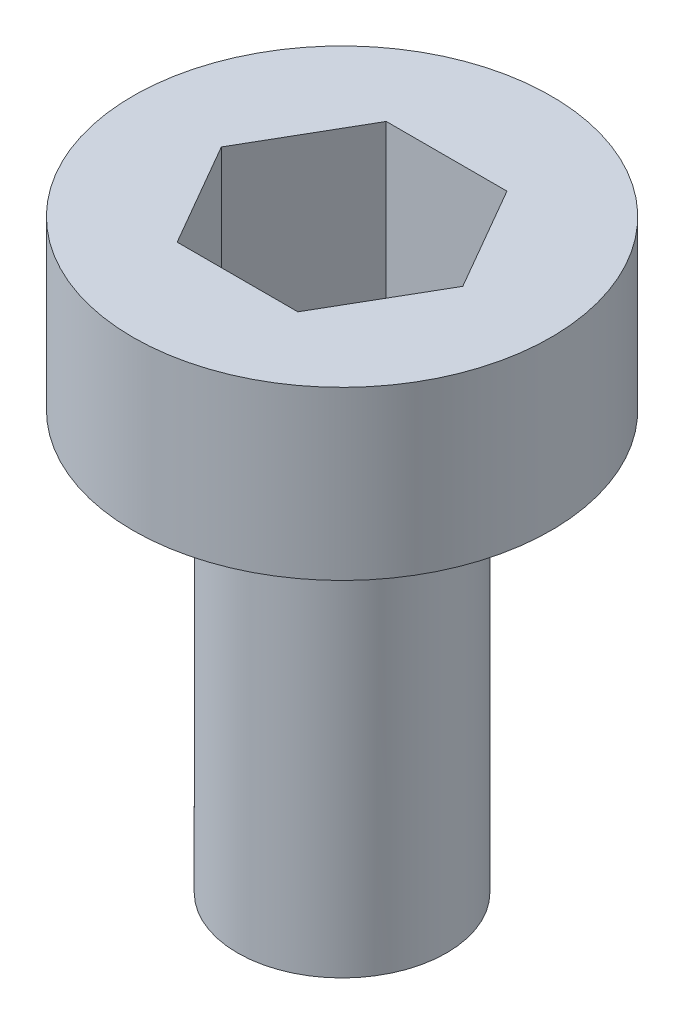
ISO-10303-21;
HEADER;
FILE_DESCRIPTION(('STEP AP214'),'2;1');
FILE_NAME('part.step','',(''),(''),'','','');
FILE_SCHEMA(('AUTOMOTIVE_DESIGN { 1 0 10303 214 1 1 1 1 }'));
ENDSEC;
DATA;
#1=APPLICATION_CONTEXT('core data for automotive mechanical design processes');
#2=APPLICATION_PROTOCOL_DEFINITION('international standard','automotive_design',2000,#1);
#3=PRODUCT_CONTEXT('',#1,'mechanical');
#4=PRODUCT('Part','Part','',(#3));
#5=PRODUCT_RELATED_PRODUCT_CATEGORY('part','',(#4));
#6=PRODUCT_DEFINITION_FORMATION('','',#4);
#7=PRODUCT_DEFINITION_CONTEXT('part definition',#1,'design');
#8=PRODUCT_DEFINITION('design','',#6,#7);
#9=PRODUCT_DEFINITION_SHAPE('','',#8);
#10=(LENGTH_UNIT() NAMED_UNIT(*) SI_UNIT(.MILLI.,.METRE.));
#11=(NAMED_UNIT(*) PLANE_ANGLE_UNIT() SI_UNIT($,.RADIAN.));
#12=(NAMED_UNIT(*) SI_UNIT($,.STERADIAN.) SOLID_ANGLE_UNIT());
#13=UNCERTAINTY_MEASURE_WITH_UNIT(LENGTH_MEASURE(1.E-05),#10,'distance_accuracy_value','');
#14=(GEOMETRIC_REPRESENTATION_CONTEXT(3) GLOBAL_UNCERTAINTY_ASSIGNED_CONTEXT((#13)) GLOBAL_UNIT_ASSIGNED_CONTEXT((#10,
#11,#12)) REPRESENTATION_CONTEXT('',''));
#15=CARTESIAN_POINT('',(0.,0.,0.));
#16=DIRECTION('',(0.,0.,1.));
#17=DIRECTION('',(1.,0.,0.));
#18=AXIS2_PLACEMENT_3D('',#15,#16,#17);
#19=CARTESIAN_POINT('',(0.,4.,0.));
#20=DIRECTION('',(0.,1.,0.));
#21=DIRECTION('',(0.,0.,1.));
#22=AXIS2_PLACEMENT_3D('',#19,#20,#21);
#23=PLANE('',#22);
#24=CARTESIAN_POINT('',(0.,4.,0.));
#25=DIRECTION('',(0.,1.,0.));
#26=DIRECTION('',(0.,0.,1.));
#27=AXIS2_PLACEMENT_3D('',#24,#25,#26);
#28=CIRCLE('',#27,5.);
#29=CARTESIAN_POINT('',(0.,4.,5.));
#30=VERTEX_POINT('',#29);
#31=EDGE_CURVE('E12',#30,#30,#28,.T.);
#32=ORIENTED_EDGE('',*,*,#31,.T.);
#33=EDGE_LOOP('',(#32));
#34=FACE_BOUND('',#33,.T.);
#35=DIRECTION('',(-0.499999999999998,0.,-0.86602540378444));
#36=VECTOR('',#35,1.);
#37=CARTESIAN_POINT('',(2.88675134594813,4.,0.));
#38=LINE('',#37,#36);
#39=CARTESIAN_POINT('',(2.88675134594813,4.,0.));
#40=VERTEX_POINT('',#39);
#41=CARTESIAN_POINT('',(1.44337567297408,4.,-2.49999999999999));
#42=VERTEX_POINT('',#41);
#43=EDGE_CURVE('E102',#40,#42,#38,.T.);
#44=ORIENTED_EDGE('',*,*,#43,.F.);
#45=DIRECTION('',(0.500000000000002,0.,-0.866025403784438));
#46=VECTOR('',#45,1.);
#47=CARTESIAN_POINT('',(1.44337567297407,4.,2.49999999999999));
#48=LINE('',#47,#46);
#49=CARTESIAN_POINT('',(1.44337567297407,4.,2.49999999999999));
#50=VERTEX_POINT('',#49);
#51=EDGE_CURVE('E94',#50,#40,#48,.T.);
#52=ORIENTED_EDGE('',*,*,#51,.F.);
#53=DIRECTION('',(1.,0.,0.));
#54=VECTOR('',#53,1.);
#55=CARTESIAN_POINT('',(-1.44337567297405,4.,2.49999999999998));
#56=LINE('',#55,#54);
#57=CARTESIAN_POINT('',(-1.44337567297405,4.,2.49999999999998));
#58=VERTEX_POINT('',#57);
#59=EDGE_CURVE('E122',#58,#50,#56,.T.);
#60=ORIENTED_EDGE('',*,*,#59,.F.);
#61=DIRECTION('',(0.499999999999998,0.,0.86602540378444));
#62=VECTOR('',#61,1.);
#63=CARTESIAN_POINT('',(-2.88675134594811,4.,0.));
#64=LINE('',#63,#62);
#65=CARTESIAN_POINT('',(-2.88675134594811,4.,0.));
#66=VERTEX_POINT('',#65);
#67=EDGE_CURVE('E120',#66,#58,#64,.T.);
#68=ORIENTED_EDGE('',*,*,#67,.F.);
#69=DIRECTION('',(-0.500000000000002,0.,0.866025403784437));
#70=VECTOR('',#69,1.);
#71=CARTESIAN_POINT('',(-1.44337567297404,4.,-2.5));
#72=LINE('',#71,#70);
#73=CARTESIAN_POINT('',(-1.44337567297404,4.,-2.5));
#74=VERTEX_POINT('',#73);
#75=EDGE_CURVE('E116',#74,#66,#72,.T.);
#76=ORIENTED_EDGE('',*,*,#75,.F.);
#77=DIRECTION('',(-1.,0.,0.));
#78=VECTOR('',#77,1.);
#79=CARTESIAN_POINT('',(1.44337567297408,4.,-2.49999999999999));
#80=LINE('',#79,#78);
#81=EDGE_CURVE('E114',#42,#74,#80,.T.);
#82=ORIENTED_EDGE('',*,*,#81,.F.);
#83=EDGE_LOOP('',(#44,#52,#60,#68,#76,#82));
#84=FACE_BOUND('',#83,.T.);
#85=ADVANCED_FACE('F41',(#34,#84),#23,.T.);
#86=CARTESIAN_POINT('',(0.,0.,0.));
#87=DIRECTION('',(0.,1.,0.));
#88=DIRECTION('',(0.,0.,1.));
#89=AXIS2_PLACEMENT_3D('',#86,#87,#88);
#90=PLANE('',#89);
#91=CARTESIAN_POINT('',(0.,0.,0.));
#92=DIRECTION('',(0.,1.,0.));
#93=DIRECTION('',(0.,0.,1.));
#94=AXIS2_PLACEMENT_3D('',#91,#92,#93);
#95=CIRCLE('',#94,5.);
#96=CARTESIAN_POINT('',(0.,0.,5.));
#97=VERTEX_POINT('',#96);
#98=EDGE_CURVE('E45',#97,#97,#95,.T.);
#99=ORIENTED_EDGE('',*,*,#98,.F.);
#100=EDGE_LOOP('',(#99));
#101=FACE_BOUND('',#100,.T.);
#102=DIRECTION('',(0.500000000000002,0.,-0.866025403784438));
#103=VECTOR('',#102,1.);
#104=CARTESIAN_POINT('',(1.44337567297407,0.,2.49999999999999));
#105=LINE('',#104,#103);
#106=CARTESIAN_POINT('',(1.44337567297407,0.,2.49999999999999));
#107=VERTEX_POINT('',#106);
#108=CARTESIAN_POINT('',(2.88675134594813,0.,0.));
#109=VERTEX_POINT('',#108);
#110=EDGE_CURVE('E64',#107,#109,#105,.T.);
#111=ORIENTED_EDGE('',*,*,#110,.T.);
#112=DIRECTION('',(-0.499999999999998,0.,-0.86602540378444));
#113=VECTOR('',#112,1.);
#114=CARTESIAN_POINT('',(2.88675134594813,0.,0.));
#115=LINE('',#114,#113);
#116=CARTESIAN_POINT('',(1.44337567297408,0.,-2.49999999999999));
#117=VERTEX_POINT('',#116);
#118=EDGE_CURVE('E109',#109,#117,#115,.T.);
#119=ORIENTED_EDGE('',*,*,#118,.T.);
#120=DIRECTION('',(-1.,0.,0.));
#121=VECTOR('',#120,1.);
#122=CARTESIAN_POINT('',(1.44337567297408,0.,-2.49999999999999));
#123=LINE('',#122,#121);
#124=CARTESIAN_POINT('',(-1.44337567297404,0.,-2.5));
#125=VERTEX_POINT('',#124);
#126=EDGE_CURVE('E126',#117,#125,#123,.T.);
#127=ORIENTED_EDGE('',*,*,#126,.T.);
#128=DIRECTION('',(-0.500000000000002,0.,0.866025403784437));
#129=VECTOR('',#128,1.);
#130=CARTESIAN_POINT('',(-1.44337567297404,0.,-2.5));
#131=LINE('',#130,#129);
#132=CARTESIAN_POINT('',(-2.88675134594811,0.,0.));
#133=VERTEX_POINT('',#132);
#134=EDGE_CURVE('E129',#125,#133,#131,.T.);
#135=ORIENTED_EDGE('',*,*,#134,.T.);
#136=DIRECTION('',(0.499999999999998,0.,0.86602540378444));
#137=VECTOR('',#136,1.);
#138=CARTESIAN_POINT('',(-2.88675134594811,0.,0.));
#139=LINE('',#138,#137);
#140=CARTESIAN_POINT('',(-1.44337567297405,0.,2.49999999999998));
#141=VERTEX_POINT('',#140);
#142=EDGE_CURVE('E132',#133,#141,#139,.T.);
#143=ORIENTED_EDGE('',*,*,#142,.T.);
#144=DIRECTION('',(1.,0.,0.));
#145=VECTOR('',#144,1.);
#146=CARTESIAN_POINT('',(-1.44337567297405,0.,2.49999999999998));
#147=LINE('',#146,#145);
#148=EDGE_CURVE('E103',#141,#107,#147,.T.);
#149=ORIENTED_EDGE('',*,*,#148,.T.);
#150=EDGE_LOOP('',(#111,#119,#127,#135,#143,#149));
#151=FACE_BOUND('',#150,.T.);
#152=ADVANCED_FACE('F149',(#101,#151),#90,.F.);
#153=CARTESIAN_POINT('',(0.,4.,0.));
#154=DIRECTION('',(0.,-1.,0.));
#155=DIRECTION('',(0.,0.,-1.));
#156=AXIS2_PLACEMENT_3D('',#153,#154,#155);
#157=CYLINDRICAL_SURFACE('',#156,5.);
#158=ORIENTED_EDGE('',*,*,#31,.F.);
#159=EDGE_LOOP('',(#158));
#160=FACE_BOUND('',#159,.T.);
#161=ORIENTED_EDGE('',*,*,#98,.T.);
#162=EDGE_LOOP('',(#161));
#163=FACE_BOUND('',#162,.T.);
#164=ADVANCED_FACE('F43',(#160,#163),#157,.T.);
#165=CARTESIAN_POINT('',(1.44337567297407,4.,2.49999999999999));
#166=DIRECTION('',(-0.866025403784438,0.,-0.500000000000002));
#167=DIRECTION('',(-0.500000000000002,0.,0.866025403784438));
#168=AXIS2_PLACEMENT_3D('',#165,#166,#167);
#169=PLANE('',#168);
#170=ORIENTED_EDGE('',*,*,#110,.F.);
#171=DIRECTION('',(0.,-1.,0.));
#172=VECTOR('',#171,1.);
#173=CARTESIAN_POINT('',(1.44337567297407,4.,2.49999999999999));
#174=LINE('',#173,#172);
#175=EDGE_CURVE('E98',#50,#107,#174,.T.);
#176=ORIENTED_EDGE('',*,*,#175,.F.);
#177=ORIENTED_EDGE('',*,*,#51,.T.);
#178=DIRECTION('',(0.,-1.,0.));
#179=VECTOR('',#178,1.);
#180=CARTESIAN_POINT('',(2.88675134594813,4.,0.));
#181=LINE('',#180,#179);
#182=EDGE_CURVE('E97',#40,#109,#181,.T.);
#183=ORIENTED_EDGE('',*,*,#182,.T.);
#184=EDGE_LOOP('',(#170,#176,#177,#183));
#185=FACE_BOUND('',#184,.T.);
#186=ADVANCED_FACE('F96',(#185),#169,.T.);
#187=CARTESIAN_POINT('',(2.88675134594813,4.,0.));
#188=DIRECTION('',(-0.86602540378444,0.,0.499999999999998));
#189=DIRECTION('',(0.499999999999998,0.,0.86602540378444));
#190=AXIS2_PLACEMENT_3D('',#187,#188,#189);
#191=PLANE('',#190);
#192=ORIENTED_EDGE('',*,*,#118,.F.);
#193=ORIENTED_EDGE('',*,*,#182,.F.);
#194=ORIENTED_EDGE('',*,*,#43,.T.);
#195=DIRECTION('',(0.,-1.,0.));
#196=VECTOR('',#195,1.);
#197=CARTESIAN_POINT('',(1.44337567297408,4.,-2.49999999999999));
#198=LINE('',#197,#196);
#199=EDGE_CURVE('E110',#42,#117,#198,.T.);
#200=ORIENTED_EDGE('',*,*,#199,.T.);
#201=EDGE_LOOP('',(#192,#193,#194,#200));
#202=FACE_BOUND('',#201,.T.);
#203=ADVANCED_FACE('F106',(#202),#191,.T.);
#204=CARTESIAN_POINT('',(1.44337567297408,4.,-2.49999999999999));
#205=DIRECTION('',(0.,0.,1.));
#206=DIRECTION('',(1.,0.,0.));
#207=AXIS2_PLACEMENT_3D('',#204,#205,#206);
#208=PLANE('',#207);
#209=ORIENTED_EDGE('',*,*,#126,.F.);
#210=ORIENTED_EDGE('',*,*,#199,.F.);
#211=ORIENTED_EDGE('',*,*,#81,.T.);
#212=DIRECTION('',(0.,-1.,0.));
#213=VECTOR('',#212,1.);
#214=CARTESIAN_POINT('',(-1.44337567297404,4.,-2.5));
#215=LINE('',#214,#213);
#216=EDGE_CURVE('E141',#74,#125,#215,.T.);
#217=ORIENTED_EDGE('',*,*,#216,.T.);
#218=EDGE_LOOP('',(#209,#210,#211,#217));
#219=FACE_BOUND('',#218,.T.);
#220=ADVANCED_FACE('F145',(#219),#208,.T.);
#221=CARTESIAN_POINT('',(-1.44337567297404,4.,-2.5));
#222=DIRECTION('',(0.866025403784437,0.,0.500000000000002));
#223=DIRECTION('',(0.500000000000002,0.,-0.866025403784437));
#224=AXIS2_PLACEMENT_3D('',#221,#222,#223);
#225=PLANE('',#224);
#226=ORIENTED_EDGE('',*,*,#134,.F.);
#227=ORIENTED_EDGE('',*,*,#216,.F.);
#228=ORIENTED_EDGE('',*,*,#75,.T.);
#229=DIRECTION('',(0.,-1.,0.));
#230=VECTOR('',#229,1.);
#231=CARTESIAN_POINT('',(-2.88675134594811,4.,0.));
#232=LINE('',#231,#230);
#233=EDGE_CURVE('E139',#66,#133,#232,.T.);
#234=ORIENTED_EDGE('',*,*,#233,.T.);
#235=EDGE_LOOP('',(#226,#227,#228,#234));
#236=FACE_BOUND('',#235,.T.);
#237=ADVANCED_FACE('F157',(#236),#225,.T.);
#238=CARTESIAN_POINT('',(-2.88675134594811,4.,0.));
#239=DIRECTION('',(0.86602540378444,0.,-0.499999999999998));
#240=DIRECTION('',(-0.499999999999998,0.,-0.86602540378444));
#241=AXIS2_PLACEMENT_3D('',#238,#239,#240);
#242=PLANE('',#241);
#243=ORIENTED_EDGE('',*,*,#142,.F.);
#244=ORIENTED_EDGE('',*,*,#233,.F.);
#245=ORIENTED_EDGE('',*,*,#67,.T.);
#246=DIRECTION('',(0.,-1.,0.));
#247=VECTOR('',#246,1.);
#248=CARTESIAN_POINT('',(-1.44337567297405,4.,2.49999999999998));
#249=LINE('',#248,#247);
#250=EDGE_CURVE('E56',#58,#141,#249,.T.);
#251=ORIENTED_EDGE('',*,*,#250,.T.);
#252=EDGE_LOOP('',(#243,#244,#245,#251));
#253=FACE_BOUND('',#252,.T.);
#254=ADVANCED_FACE('F155',(#253),#242,.T.);
#255=CARTESIAN_POINT('',(-1.44337567297405,4.,2.49999999999998));
#256=DIRECTION('',(0.,0.,-1.));
#257=DIRECTION('',(-1.,0.,0.));
#258=AXIS2_PLACEMENT_3D('',#255,#256,#257);
#259=PLANE('',#258);
#260=ORIENTED_EDGE('',*,*,#148,.F.);
#261=ORIENTED_EDGE('',*,*,#250,.F.);
#262=ORIENTED_EDGE('',*,*,#59,.T.);
#263=ORIENTED_EDGE('',*,*,#175,.T.);
#264=EDGE_LOOP('',(#260,#261,#262,#263));
#265=FACE_BOUND('',#264,.T.);
#266=ADVANCED_FACE('F151',(#265),#259,.T.);
#267=CLOSED_SHELL('',(#85,#152,#164,#186,#203,#220,#237,#254,#266));
#268=MANIFOLD_SOLID_BREP('B2',#267);
#269=CARTESIAN_POINT('',(0.,-10.,0.));
#270=DIRECTION('',(0.,1.,0.));
#271=DIRECTION('',(0.,0.,1.));
#272=AXIS2_PLACEMENT_3D('',#269,#270,#271);
#273=CYLINDRICAL_SURFACE('',#272,2.5);
#274=CARTESIAN_POINT('',(0.,-10.,0.));
#275=DIRECTION('',(0.,1.,0.));
#276=DIRECTION('',(0.,0.,1.));
#277=AXIS2_PLACEMENT_3D('',#274,#275,#276);
#278=CIRCLE('',#277,2.5);
#279=CARTESIAN_POINT('',(0.,-10.,2.5));
#280=VERTEX_POINT('',#279);
#281=EDGE_CURVE('E39',#280,#280,#278,.T.);
#282=ORIENTED_EDGE('',*,*,#281,.T.);
#283=EDGE_LOOP('',(#282));
#284=FACE_BOUND('',#283,.T.);
#285=CARTESIAN_POINT('',(0.,0.,0.));
#286=DIRECTION('',(0.,1.,0.));
#287=DIRECTION('',(0.,0.,1.));
#288=AXIS2_PLACEMENT_3D('',#285,#286,#287);
#289=CIRCLE('',#288,2.5);
#290=CARTESIAN_POINT('',(0.,0.,2.49999999999999));
#291=VERTEX_POINT('',#290);
#292=CARTESIAN_POINT('',(2.16506350946109,0.,1.25));
#293=VERTEX_POINT('',#292);
#294=EDGE_CURVE('E241',#291,#293,#289,.T.);
#295=ORIENTED_EDGE('',*,*,#294,.F.);
#296=CARTESIAN_POINT('',(-2.16506350946108,0.,1.24999999999999));
#297=VERTEX_POINT('',#296);
#298=EDGE_CURVE('E252',#297,#291,#289,.T.);
#299=ORIENTED_EDGE('',*,*,#298,.F.);
#300=CARTESIAN_POINT('',(-2.16506350946108,0.,-1.25));
#301=VERTEX_POINT('',#300);
#302=EDGE_CURVE('E256',#301,#297,#289,.T.);
#303=ORIENTED_EDGE('',*,*,#302,.F.);
#304=CARTESIAN_POINT('',(0.,0.,-2.5));
#305=VERTEX_POINT('',#304);
#306=EDGE_CURVE('E274',#305,#301,#289,.T.);
#307=ORIENTED_EDGE('',*,*,#306,.F.);
#308=CARTESIAN_POINT('',(2.1650635094611,0.,-1.25));
#309=VERTEX_POINT('',#308);
#310=EDGE_CURVE('E272',#309,#305,#289,.T.);
#311=ORIENTED_EDGE('',*,*,#310,.F.);
#312=EDGE_CURVE('E271',#293,#309,#289,.T.);
#313=ORIENTED_EDGE('',*,*,#312,.F.);
#314=EDGE_LOOP('',(#295,#299,#303,#307,#311,#313));
#315=FACE_BOUND('',#314,.T.);
#316=ADVANCED_FACE('F238',(#284,#315),#273,.T.);
#317=CARTESIAN_POINT('',(0.,-10.,0.));
#318=DIRECTION('',(0.,1.,0.));
#319=DIRECTION('',(0.,0.,1.));
#320=AXIS2_PLACEMENT_3D('',#317,#318,#319);
#321=PLANE('',#320);
#322=ORIENTED_EDGE('',*,*,#281,.F.);
#323=EDGE_LOOP('',(#322));
#324=FACE_BOUND('',#323,.T.);
#325=ADVANCED_FACE('F276',(#324),#321,.F.);
#326=CARTESIAN_POINT('',(0.,0.,0.));
#327=DIRECTION('',(0.,1.,0.));
#328=DIRECTION('',(0.,0.,1.));
#329=AXIS2_PLACEMENT_3D('',#326,#327,#328);
#330=PLANE('',#329);
#331=ORIENTED_EDGE('',*,*,#294,.T.);
#332=ORIENTED_EDGE('',*,*,#312,.T.);
#333=ORIENTED_EDGE('',*,*,#310,.T.);
#334=ORIENTED_EDGE('',*,*,#306,.T.);
#335=ORIENTED_EDGE('',*,*,#302,.T.);
#336=ORIENTED_EDGE('',*,*,#298,.T.);
#337=EDGE_LOOP('',(#331,#332,#333,#334,#335,#336));
#338=FACE_BOUND('',#337,.T.);
#339=ADVANCED_FACE('F269',(#338),#330,.T.);
#340=CLOSED_SHELL('',(#316,#325,#339));
#341=MANIFOLD_SOLID_BREP('B6',#340);
#342=ADVANCED_BREP_SHAPE_REPRESENTATION('',(#18,#268,#341),#14);
#343=SHAPE_DEFINITION_REPRESENTATION(#9,#342);
ENDSEC;
END-ISO-10303-21;
